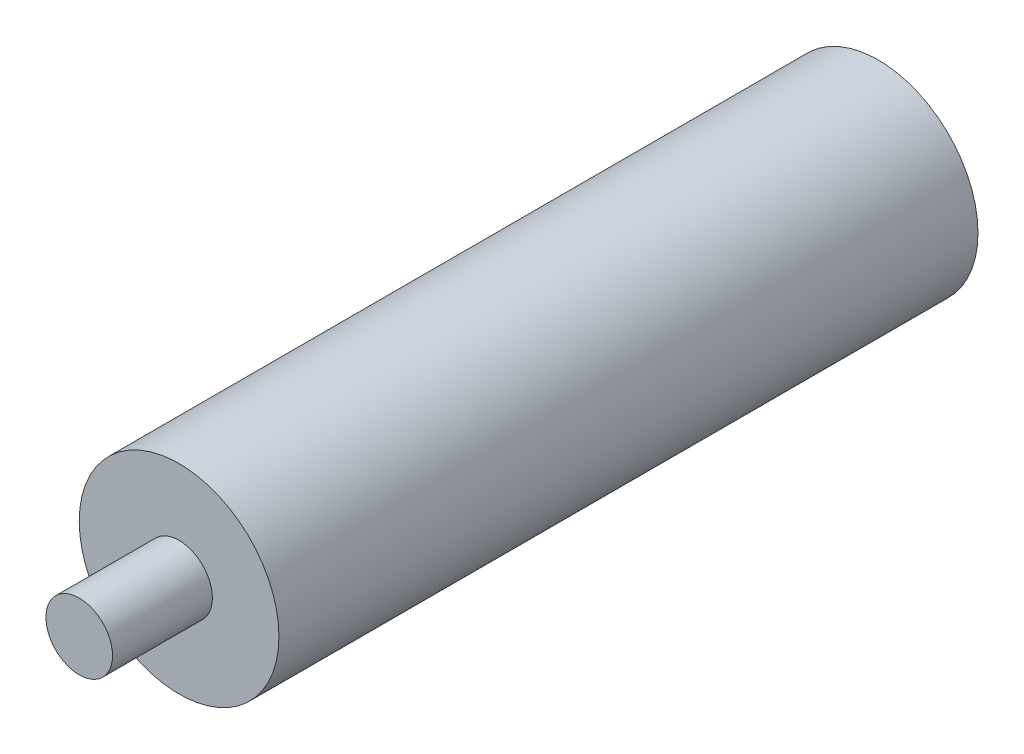
ISO-10303-21;
HEADER;
FILE_DESCRIPTION(('STEP AP214'),'2;1');
FILE_NAME('part.step','',(''),(''),'','','');
FILE_SCHEMA(('AUTOMOTIVE_DESIGN { 1 0 10303 214 1 1 1 1 }'));
ENDSEC;
DATA;
#1=APPLICATION_CONTEXT('core data for automotive mechanical design processes');
#2=APPLICATION_PROTOCOL_DEFINITION('international standard','automotive_design',2000,#1);
#3=PRODUCT_CONTEXT('',#1,'mechanical');
#4=PRODUCT('Part','Part','',(#3));
#5=PRODUCT_RELATED_PRODUCT_CATEGORY('part','',(#4));
#6=PRODUCT_DEFINITION_FORMATION('','',#4);
#7=PRODUCT_DEFINITION_CONTEXT('part definition',#1,'design');
#8=PRODUCT_DEFINITION('design','',#6,#7);
#9=PRODUCT_DEFINITION_SHAPE('','',#8);
#10=(LENGTH_UNIT() NAMED_UNIT(*) SI_UNIT(.MILLI.,.METRE.));
#11=(NAMED_UNIT(*) PLANE_ANGLE_UNIT() SI_UNIT($,.RADIAN.));
#12=(NAMED_UNIT(*) SI_UNIT($,.STERADIAN.) SOLID_ANGLE_UNIT());
#13=UNCERTAINTY_MEASURE_WITH_UNIT(LENGTH_MEASURE(1.E-05),#10,'distance_accuracy_value','');
#14=(GEOMETRIC_REPRESENTATION_CONTEXT(3) GLOBAL_UNCERTAINTY_ASSIGNED_CONTEXT((#13)) GLOBAL_UNIT_ASSIGNED_CONTEXT((#10,
#11,#12)) REPRESENTATION_CONTEXT('',''));
#15=CARTESIAN_POINT('',(0.,0.,0.));
#16=DIRECTION('',(0.,0.,1.));
#17=DIRECTION('',(1.,0.,0.));
#18=AXIS2_PLACEMENT_3D('',#15,#16,#17);
#19=CARTESIAN_POINT('',(0.,0.,21.));
#20=DIRECTION('',(0.,0.,-1.));
#21=DIRECTION('',(-1.,0.,0.));
#22=AXIS2_PLACEMENT_3D('',#19,#20,#21);
#23=CYLINDRICAL_SURFACE('',#22,3.);
#24=CARTESIAN_POINT('',(0.,0.,21.));
#25=DIRECTION('',(0.,0.,1.));
#26=DIRECTION('',(1.,0.,0.));
#27=AXIS2_PLACEMENT_3D('',#24,#25,#26);
#28=CIRCLE('',#27,3.);
#29=CARTESIAN_POINT('',(-3.,0.,21.));
#30=VERTEX_POINT('',#29);
#31=EDGE_CURVE('E50',#30,#30,#28,.T.);
#32=CARTESIAN_POINT('',(0.,0.,0.));
#33=DIRECTION('',(0.,0.,1.));
#34=DIRECTION('',(1.,0.,0.));
#35=AXIS2_PLACEMENT_3D('',#32,#33,#34);
#36=CIRCLE('',#35,3.);
#37=CARTESIAN_POINT('',(-3.,0.,0.));
#38=VERTEX_POINT('',#37);
#39=EDGE_CURVE('E45',#38,#38,#36,.T.);
#40=CARTESIAN_POINT('',(-3.,0.,21.));
#41=CARTESIAN_POINT('',(-3.,0.,20.78125));
#42=CARTESIAN_POINT('',(-3.,0.,20.5625));
#43=CARTESIAN_POINT('',(-3.,0.,20.125));
#44=CARTESIAN_POINT('',(-3.,0.,19.90625));
#45=CARTESIAN_POINT('',(-3.,0.,19.46875));
#46=CARTESIAN_POINT('',(-3.,0.,19.25));
#47=CARTESIAN_POINT('',(-3.,0.,18.8125));
#48=CARTESIAN_POINT('',(-3.,0.,18.59375));
#49=CARTESIAN_POINT('',(-3.,0.,18.15625));
#50=CARTESIAN_POINT('',(-3.,0.,17.9375));
#51=CARTESIAN_POINT('',(-3.,0.,17.5));
#52=CARTESIAN_POINT('',(-3.,0.,17.28125));
#53=CARTESIAN_POINT('',(-3.,0.,16.84375));
#54=CARTESIAN_POINT('',(-3.,0.,16.625));
#55=CARTESIAN_POINT('',(-3.,0.,16.1875));
#56=CARTESIAN_POINT('',(-3.,0.,15.96875));
#57=CARTESIAN_POINT('',(-3.,0.,15.53125));
#58=CARTESIAN_POINT('',(-3.,0.,15.3125));
#59=CARTESIAN_POINT('',(-3.,0.,14.875));
#60=CARTESIAN_POINT('',(-3.,0.,14.65625));
#61=CARTESIAN_POINT('',(-3.,0.,14.21875));
#62=CARTESIAN_POINT('',(-3.,0.,14.));
#63=CARTESIAN_POINT('',(-3.,0.,13.5625));
#64=CARTESIAN_POINT('',(-3.,0.,13.34375));
#65=CARTESIAN_POINT('',(-3.,0.,12.90625));
#66=CARTESIAN_POINT('',(-3.,0.,12.6875));
#67=CARTESIAN_POINT('',(-3.,0.,12.25));
#68=CARTESIAN_POINT('',(-3.,0.,12.03125));
#69=CARTESIAN_POINT('',(-3.,0.,11.59375));
#70=CARTESIAN_POINT('',(-3.,0.,11.375));
#71=CARTESIAN_POINT('',(-3.,0.,10.9375));
#72=CARTESIAN_POINT('',(-3.,0.,10.71875));
#73=CARTESIAN_POINT('',(-3.,0.,10.28125));
#74=CARTESIAN_POINT('',(-3.,0.,10.0625));
#75=CARTESIAN_POINT('',(-3.,0.,9.625));
#76=CARTESIAN_POINT('',(-3.,0.,9.40625));
#77=CARTESIAN_POINT('',(-3.,0.,8.96875));
#78=CARTESIAN_POINT('',(-3.,0.,8.75));
#79=CARTESIAN_POINT('',(-3.,0.,8.3125));
#80=CARTESIAN_POINT('',(-3.,0.,8.09375));
#81=CARTESIAN_POINT('',(-3.,0.,7.65625));
#82=CARTESIAN_POINT('',(-3.,0.,7.4375));
#83=CARTESIAN_POINT('',(-3.,0.,7.));
#84=CARTESIAN_POINT('',(-3.,0.,6.78125));
#85=CARTESIAN_POINT('',(-3.,0.,6.34375));
#86=CARTESIAN_POINT('',(-3.,0.,6.125));
#87=CARTESIAN_POINT('',(-3.,0.,5.6875));
#88=CARTESIAN_POINT('',(-3.,0.,5.46875));
#89=CARTESIAN_POINT('',(-3.,0.,5.03125));
#90=CARTESIAN_POINT('',(-3.,0.,4.8125));
#91=CARTESIAN_POINT('',(-3.,0.,4.375));
#92=CARTESIAN_POINT('',(-3.,0.,4.15625));
#93=CARTESIAN_POINT('',(-3.,0.,3.71875));
#94=CARTESIAN_POINT('',(-3.,0.,3.5));
#95=CARTESIAN_POINT('',(-3.,0.,3.0625));
#96=CARTESIAN_POINT('',(-3.,0.,2.84375));
#97=CARTESIAN_POINT('',(-3.,0.,2.40625));
#98=CARTESIAN_POINT('',(-3.,0.,2.1875));
#99=CARTESIAN_POINT('',(-3.,0.,1.75));
#100=CARTESIAN_POINT('',(-3.,0.,1.53125));
#101=CARTESIAN_POINT('',(-3.,0.,1.09375));
#102=CARTESIAN_POINT('',(-3.,0.,0.875000000000001));
#103=CARTESIAN_POINT('',(-3.,0.,0.4375));
#104=CARTESIAN_POINT('',(-3.,0.,0.21875));
#105=CARTESIAN_POINT('',(-3.,0.,0.));
#106=B_SPLINE_CURVE_WITH_KNOTS('',3,(#40,#41,#42,#43,#44,#45,#46,#47,#48,#49,#50,#51,#52,#53,
#54,#55,#56,#57,#58,#59,#60,#61,#62,#63,#64,#65,#66,#67,#68,#69,#70,#71,#72,#73,#74,#75,#76,#77,
#78,#79,#80,#81,#82,#83,#84,#85,#86,#87,#88,#89,#90,#91,#92,#93,#94,#95,#96,#97,#98,#99,#100,
#101,#102,#103,#104,#105),.UNSPECIFIED.,.F.,.F.,(4,2,2,2,2,2,2,2,2,2,2,2,2,2,2,2,2,2,2,2,2,2,2,
2,2,2,2,2,2,2,2,2,4),(0.,0.656249999999997,1.3125,1.96875,2.625,3.28125,3.9375,4.59375,5.25,
5.90625,6.5625,7.21875,7.875,8.53125,9.1875,9.84375,10.5,11.15625,11.8125,12.46875,13.125,
13.78125,14.4375,15.09375,15.75,16.40625,17.0625,17.71875,18.375,19.03125,19.6875,20.34375,21.),.UNSPECIFIED.);
#107=EDGE_CURVE('BSEAM42',#30,#38,#106,.T.);
#108=ORIENTED_EDGE('',*,*,#31,.F.);
#109=ORIENTED_EDGE('',*,*,#39,.T.);
#110=ORIENTED_EDGE('',*,*,#107,.T.);
#111=ORIENTED_EDGE('',*,*,#107,.F.);
#112=EDGE_LOOP('',(#108,#110,#109,#111));
#113=FACE_BOUND('',#112,.T.);
#114=ADVANCED_FACE('F42',(#113),#23,.T.);
#115=CARTESIAN_POINT('',(0.,0.,21.));
#116=DIRECTION('',(0.,0.,1.));
#117=DIRECTION('',(1.,0.,0.));
#118=AXIS2_PLACEMENT_3D('',#115,#116,#117);
#119=PLANE('',#118);
#120=CARTESIAN_POINT('',(0.,0.,21.));
#121=DIRECTION('',(0.,0.,1.));
#122=DIRECTION('',(1.,0.,0.));
#123=AXIS2_PLACEMENT_3D('',#120,#121,#122);
#124=CIRCLE('',#123,1.);
#125=CARTESIAN_POINT('',(1.,0.,21.));
#126=VERTEX_POINT('',#125);
#127=EDGE_CURVE('E10',#126,#126,#124,.T.);
#128=ORIENTED_EDGE('',*,*,#127,.F.);
#129=EDGE_LOOP('',(#128));
#130=FACE_BOUND('',#129,.T.);
#131=ORIENTED_EDGE('',*,*,#31,.T.);
#132=EDGE_LOOP('',(#131));
#133=FACE_BOUND('',#132,.T.);
#134=ADVANCED_FACE('F70',(#130,#133),#119,.T.);
#135=CARTESIAN_POINT('',(0.,0.,0.));
#136=DIRECTION('',(0.,0.,1.));
#137=DIRECTION('',(1.,0.,0.));
#138=AXIS2_PLACEMENT_3D('',#135,#136,#137);
#139=PLANE('',#138);
#140=ORIENTED_EDGE('',*,*,#39,.F.);
#141=EDGE_LOOP('',(#140));
#142=FACE_BOUND('',#141,.T.);
#143=ADVANCED_FACE('F67',(#142),#139,.F.);
#144=CARTESIAN_POINT('',(0.,0.,24.));
#145=DIRECTION('',(0.,0.,-1.));
#146=DIRECTION('',(-1.,0.,0.));
#147=AXIS2_PLACEMENT_3D('',#144,#145,#146);
#148=CYLINDRICAL_SURFACE('',#147,1.);
#149=CARTESIAN_POINT('',(0.,0.,24.));
#150=DIRECTION('',(0.,0.,1.));
#151=DIRECTION('',(1.,0.,0.));
#152=AXIS2_PLACEMENT_3D('',#149,#150,#151);
#153=CIRCLE('',#152,1.);
#154=CARTESIAN_POINT('',(1.,0.,24.));
#155=VERTEX_POINT('',#154);
#156=EDGE_CURVE('E57',#155,#155,#153,.T.);
#157=ORIENTED_EDGE('',*,*,#156,.F.);
#158=EDGE_LOOP('',(#157));
#159=FACE_BOUND('',#158,.T.);
#160=ORIENTED_EDGE('',*,*,#127,.T.);
#161=EDGE_LOOP('',(#160));
#162=FACE_BOUND('',#161,.T.);
#163=ADVANCED_FACE('F69',(#159,#162),#148,.T.);
#164=CARTESIAN_POINT('',(0.,0.,24.));
#165=DIRECTION('',(0.,0.,1.));
#166=DIRECTION('',(1.,0.,0.));
#167=AXIS2_PLACEMENT_3D('',#164,#165,#166);
#168=PLANE('',#167);
#169=ORIENTED_EDGE('',*,*,#156,.T.);
#170=EDGE_LOOP('',(#169));
#171=FACE_BOUND('',#170,.T.);
#172=ADVANCED_FACE('F75',(#171),#168,.T.);
#173=CLOSED_SHELL('',(#114,#134,#143,#163,#172));
#174=MANIFOLD_SOLID_BREP('B2',#173);
#175=ADVANCED_BREP_SHAPE_REPRESENTATION('',(#18,#174),#14);
#176=SHAPE_DEFINITION_REPRESENTATION(#9,#175);
ENDSEC;
END-ISO-10303-21;
